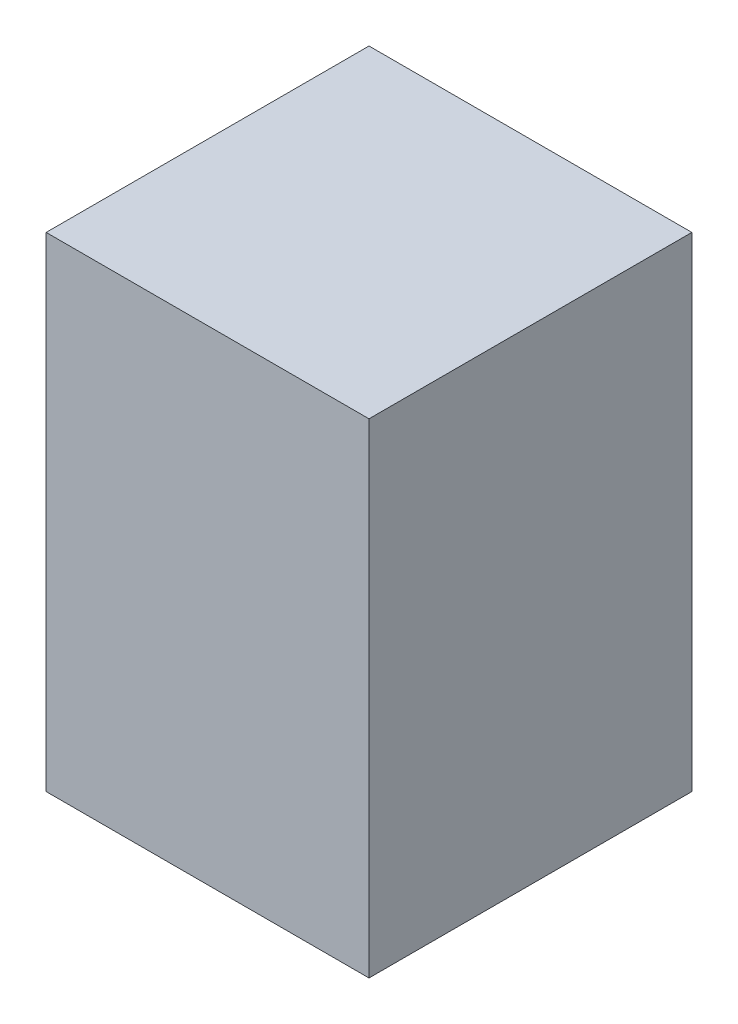
ISO-10303-21;
HEADER;
FILE_DESCRIPTION(('STEP AP214'),'2;1');
FILE_NAME('part.step','',(''),(''),'','','');
FILE_SCHEMA(('AUTOMOTIVE_DESIGN { 1 0 10303 214 1 1 1 1 }'));
ENDSEC;
DATA;
#1=APPLICATION_CONTEXT('core data for automotive mechanical design processes');
#2=APPLICATION_PROTOCOL_DEFINITION('international standard','automotive_design',2000,#1);
#3=PRODUCT_CONTEXT('',#1,'mechanical');
#4=PRODUCT('Part','Part','',(#3));
#5=PRODUCT_RELATED_PRODUCT_CATEGORY('part','',(#4));
#6=PRODUCT_DEFINITION_FORMATION('','',#4);
#7=PRODUCT_DEFINITION_CONTEXT('part definition',#1,'design');
#8=PRODUCT_DEFINITION('design','',#6,#7);
#9=PRODUCT_DEFINITION_SHAPE('','',#8);
#10=(LENGTH_UNIT() NAMED_UNIT(*) SI_UNIT(.MILLI.,.METRE.));
#11=(NAMED_UNIT(*) PLANE_ANGLE_UNIT() SI_UNIT($,.RADIAN.));
#12=(NAMED_UNIT(*) SI_UNIT($,.STERADIAN.) SOLID_ANGLE_UNIT());
#13=UNCERTAINTY_MEASURE_WITH_UNIT(LENGTH_MEASURE(1.E-05),#10,'distance_accuracy_value','');
#14=(GEOMETRIC_REPRESENTATION_CONTEXT(3) GLOBAL_UNCERTAINTY_ASSIGNED_CONTEXT((#13)) GLOBAL_UNIT_ASSIGNED_CONTEXT((#10,
#11,#12)) REPRESENTATION_CONTEXT('',''));
#15=CARTESIAN_POINT('',(0.,0.,0.));
#16=DIRECTION('',(0.,0.,1.));
#17=DIRECTION('',(1.,0.,0.));
#18=AXIS2_PLACEMENT_3D('',#15,#16,#17);
#19=CARTESIAN_POINT('',(5.,0.,5.));
#20=DIRECTION('',(0.,0.384615384615385,-0.923076923076923));
#21=DIRECTION('',(0.,0.923076923076923,0.384615384615385));
#22=AXIS2_PLACEMENT_3D('',#19,#20,#21);
#23=PLANE('',#22);
#24=DIRECTION('',(0.,0.923076923076923,0.384615384615385));
#25=VECTOR('',#24,1.);
#26=CARTESIAN_POINT('',(3.75,0.,5.));
#27=LINE('',#26,#25);
#28=CARTESIAN_POINT('',(3.75,-6.,2.5));
#29=VERTEX_POINT('',#28);
#30=CARTESIAN_POINT('',(3.75,0.,5.));
#31=VERTEX_POINT('',#30);
#32=EDGE_CURVE('E130',#29,#31,#27,.T.);
#33=ORIENTED_EDGE('',*,*,#32,.F.);
#34=DIRECTION('',(-1.,0.,0.));
#35=VECTOR('',#34,1.);
#36=CARTESIAN_POINT('',(5.,-6.,2.5));
#37=LINE('',#36,#35);
#38=CARTESIAN_POINT('',(5.,-6.,2.5));
#39=VERTEX_POINT('',#38);
#40=EDGE_CURVE('E158',#39,#29,#37,.T.);
#41=ORIENTED_EDGE('',*,*,#40,.F.);
#42=DIRECTION('',(0.,-0.923076923076923,-0.384615384615385));
#43=VECTOR('',#42,1.);
#44=CARTESIAN_POINT('',(5.,0.,5.));
#45=LINE('',#44,#43);
#46=CARTESIAN_POINT('',(5.,0.,5.));
#47=VERTEX_POINT('',#46);
#48=EDGE_CURVE('E150',#47,#39,#45,.T.);
#49=ORIENTED_EDGE('',*,*,#48,.F.);
#50=DIRECTION('',(-1.,0.,0.));
#51=VECTOR('',#50,1.);
#52=CARTESIAN_POINT('',(5.,0.,5.));
#53=LINE('',#52,#51);
#54=EDGE_CURVE('E145',#47,#31,#53,.T.);
#55=ORIENTED_EDGE('',*,*,#54,.T.);
#56=EDGE_LOOP('',(#33,#41,#49,#55));
#57=FACE_BOUND('',#56,.T.);
#58=ADVANCED_FACE('F39',(#57),#23,.F.);
#59=CARTESIAN_POINT('',(5.,-6.,2.5));
#60=DIRECTION('',(0.,1.,0.));
#61=DIRECTION('',(0.,0.,1.));
#62=AXIS2_PLACEMENT_3D('',#59,#60,#61);
#63=PLANE('',#62);
#64=DIRECTION('',(0.,0.,1.));
#65=VECTOR('',#64,1.);
#66=CARTESIAN_POINT('',(3.75,-6.,2.5));
#67=LINE('',#66,#65);
#68=CARTESIAN_POINT('',(3.75,-6.,-2.5));
#69=VERTEX_POINT('',#68);
#70=EDGE_CURVE('E133',#69,#29,#67,.T.);
#71=ORIENTED_EDGE('',*,*,#70,.F.);
#72=DIRECTION('',(-1.,0.,0.));
#73=VECTOR('',#72,1.);
#74=CARTESIAN_POINT('',(5.,-6.,-2.5));
#75=LINE('',#74,#73);
#76=CARTESIAN_POINT('',(5.,-6.,-2.5));
#77=VERTEX_POINT('',#76);
#78=EDGE_CURVE('E227',#77,#69,#75,.T.);
#79=ORIENTED_EDGE('',*,*,#78,.F.);
#80=DIRECTION('',(0.,0.,-1.));
#81=VECTOR('',#80,1.);
#82=CARTESIAN_POINT('',(5.,-6.,2.5));
#83=LINE('',#82,#81);
#84=EDGE_CURVE('E213',#39,#77,#83,.T.);
#85=ORIENTED_EDGE('',*,*,#84,.F.);
#86=ORIENTED_EDGE('',*,*,#40,.T.);
#87=EDGE_LOOP('',(#71,#79,#85,#86));
#88=FACE_BOUND('',#87,.T.);
#89=ADVANCED_FACE('F265',(#88),#63,.F.);
#90=CARTESIAN_POINT('',(5.,-6.,-2.5));
#91=DIRECTION('',(0.,0.384615384615384,0.923076923076923));
#92=DIRECTION('',(0.,-0.923076923076923,0.384615384615384));
#93=AXIS2_PLACEMENT_3D('',#90,#91,#92);
#94=PLANE('',#93);
#95=DIRECTION('',(0.,-0.923076923076923,0.384615384615384));
#96=VECTOR('',#95,1.);
#97=CARTESIAN_POINT('',(3.75,-6.,-2.5));
#98=LINE('',#97,#96);
#99=CARTESIAN_POINT('',(3.75,0.,-5.));
#100=VERTEX_POINT('',#99);
#101=EDGE_CURVE('E185',#100,#69,#98,.T.);
#102=ORIENTED_EDGE('',*,*,#101,.F.);
#103=DIRECTION('',(-1.,0.,0.));
#104=VECTOR('',#103,1.);
#105=CARTESIAN_POINT('',(5.,0.,-5.));
#106=LINE('',#105,#104);
#107=CARTESIAN_POINT('',(5.,0.,-5.));
#108=VERTEX_POINT('',#107);
#109=EDGE_CURVE('E147',#108,#100,#106,.T.);
#110=ORIENTED_EDGE('',*,*,#109,.F.);
#111=DIRECTION('',(0.,0.923076923076923,-0.384615384615384));
#112=VECTOR('',#111,1.);
#113=CARTESIAN_POINT('',(5.,-6.,-2.5));
#114=LINE('',#113,#112);
#115=EDGE_CURVE('E215',#77,#108,#114,.T.);
#116=ORIENTED_EDGE('',*,*,#115,.F.);
#117=ORIENTED_EDGE('',*,*,#78,.T.);
#118=EDGE_LOOP('',(#102,#110,#116,#117));
#119=FACE_BOUND('',#118,.T.);
#120=ADVANCED_FACE('F271',(#119),#94,.F.);
#121=CARTESIAN_POINT('',(5.,-3.,0.));
#122=DIRECTION('',(-1.,0.,0.));
#123=DIRECTION('',(0.,0.,1.));
#124=AXIS2_PLACEMENT_3D('',#121,#122,#123);
#125=CYLINDRICAL_SURFACE('',#124,1.);
#126=CARTESIAN_POINT('',(5.,-3.,0.));
#127=DIRECTION('',(1.,0.,0.));
#128=DIRECTION('',(0.,0.,-1.));
#129=AXIS2_PLACEMENT_3D('',#126,#127,#128);
#130=CIRCLE('',#129,1.);
#131=CARTESIAN_POINT('',(5.,-3.,-1.));
#132=VERTEX_POINT('',#131);
#133=EDGE_CURVE('E203',#132,#132,#130,.T.);
#134=ORIENTED_EDGE('',*,*,#133,.T.);
#135=EDGE_LOOP('',(#134));
#136=FACE_BOUND('',#135,.T.);
#137=CARTESIAN_POINT('',(3.75,-3.,0.));
#138=DIRECTION('',(-1.,0.,0.));
#139=DIRECTION('',(0.,0.,1.));
#140=AXIS2_PLACEMENT_3D('',#137,#138,#139);
#141=CIRCLE('',#140,1.);
#142=CARTESIAN_POINT('',(3.75,-3.,1.));
#143=VERTEX_POINT('',#142);
#144=EDGE_CURVE('E183',#143,#143,#141,.T.);
#145=ORIENTED_EDGE('',*,*,#144,.T.);
#146=EDGE_LOOP('',(#145));
#147=FACE_BOUND('',#146,.T.);
#148=ADVANCED_FACE('F262',(#136,#147),#125,.F.);
#149=CARTESIAN_POINT('',(0.,0.,0.));
#150=DIRECTION('',(0.,-1.,0.));
#151=DIRECTION('',(0.,0.,-1.));
#152=AXIS2_PLACEMENT_3D('',#149,#150,#151);
#153=PLANE('',#152);
#154=CARTESIAN_POINT('',(-3.75,0.,5.));
#155=VERTEX_POINT('',#154);
#156=CARTESIAN_POINT('',(-5.,0.,5.));
#157=VERTEX_POINT('',#156);
#158=EDGE_CURVE('E153',#155,#157,#53,.T.);
#159=ORIENTED_EDGE('',*,*,#158,.F.);
#160=DIRECTION('',(0.,0.,1.));
#161=VECTOR('',#160,1.);
#162=CARTESIAN_POINT('',(-3.75,0.,9.09176293791679));
#163=LINE('',#162,#161);
#164=CARTESIAN_POINT('',(-3.75,0.,-5.));
#165=VERTEX_POINT('',#164);
#166=EDGE_CURVE('E148',#165,#155,#163,.T.);
#167=ORIENTED_EDGE('',*,*,#166,.F.);
#168=CARTESIAN_POINT('',(-5.,0.,-5.));
#169=VERTEX_POINT('',#168);
#170=EDGE_CURVE('E64',#165,#169,#106,.T.);
#171=ORIENTED_EDGE('',*,*,#170,.T.);
#172=DIRECTION('',(0.,0.,1.));
#173=VECTOR('',#172,1.);
#174=CARTESIAN_POINT('',(-5.,0.,-5.));
#175=LINE('',#174,#173);
#176=EDGE_CURVE('E206',#169,#157,#175,.T.);
#177=ORIENTED_EDGE('',*,*,#176,.T.);
#178=EDGE_LOOP('',(#159,#167,#171,#177));
#179=FACE_BOUND('',#178,.T.);
#180=DIRECTION('',(0.,0.,1.));
#181=VECTOR('',#180,1.);
#182=CARTESIAN_POINT('',(3.75,0.,9.09176293791679));
#183=LINE('',#182,#181);
#184=EDGE_CURVE('E56',#100,#31,#183,.T.);
#185=ORIENTED_EDGE('',*,*,#184,.T.);
#186=ORIENTED_EDGE('',*,*,#54,.F.);
#187=DIRECTION('',(0.,0.,1.));
#188=VECTOR('',#187,1.);
#189=CARTESIAN_POINT('',(5.,0.,-5.));
#190=LINE('',#189,#188);
#191=EDGE_CURVE('E209',#108,#47,#190,.T.);
#192=ORIENTED_EDGE('',*,*,#191,.F.);
#193=ORIENTED_EDGE('',*,*,#109,.T.);
#194=EDGE_LOOP('',(#185,#186,#192,#193));
#195=FACE_BOUND('',#194,.T.);
#196=DIRECTION('',(0.,0.,-1.));
#197=VECTOR('',#196,1.);
#198=CARTESIAN_POINT('',(20.,0.,20.));
#199=LINE('',#198,#197);
#200=CARTESIAN_POINT('',(20.,0.,20.));
#201=VERTEX_POINT('',#200);
#202=CARTESIAN_POINT('',(20.,0.,-20.));
#203=VERTEX_POINT('',#202);
#204=EDGE_CURVE('E152',#201,#203,#199,.T.);
#205=ORIENTED_EDGE('',*,*,#204,.F.);
#206=DIRECTION('',(1.,0.,0.));
#207=VECTOR('',#206,1.);
#208=CARTESIAN_POINT('',(-20.,0.,20.));
#209=LINE('',#208,#207);
#210=CARTESIAN_POINT('',(-20.,0.,20.));
#211=VERTEX_POINT('',#210);
#212=EDGE_CURVE('E166',#211,#201,#209,.T.);
#213=ORIENTED_EDGE('',*,*,#212,.F.);
#214=DIRECTION('',(0.,0.,1.));
#215=VECTOR('',#214,1.);
#216=CARTESIAN_POINT('',(-20.,0.,20.));
#217=LINE('',#216,#215);
#218=CARTESIAN_POINT('',(-20.,0.,-20.));
#219=VERTEX_POINT('',#218);
#220=EDGE_CURVE('E174',#219,#211,#217,.T.);
#221=ORIENTED_EDGE('',*,*,#220,.F.);
#222=DIRECTION('',(-1.,0.,0.));
#223=VECTOR('',#222,1.);
#224=CARTESIAN_POINT('',(-20.,0.,-20.));
#225=LINE('',#224,#223);
#226=EDGE_CURVE('E156',#203,#219,#225,.T.);
#227=ORIENTED_EDGE('',*,*,#226,.F.);
#228=EDGE_LOOP('',(#205,#213,#221,#227));
#229=FACE_BOUND('',#228,.T.);
#230=ADVANCED_FACE('F142',(#179,#195,#229),#153,.T.);
#231=CARTESIAN_POINT('',(20.,60.,20.));
#232=DIRECTION('',(-1.,0.,0.));
#233=DIRECTION('',(0.,0.,1.));
#234=AXIS2_PLACEMENT_3D('',#231,#232,#233);
#235=PLANE('',#234);
#236=ORIENTED_EDGE('',*,*,#204,.T.);
#237=DIRECTION('',(0.,-1.,0.));
#238=VECTOR('',#237,1.);
#239=CARTESIAN_POINT('',(20.,60.,-20.));
#240=LINE('',#239,#238);
#241=CARTESIAN_POINT('',(20.,60.,-20.));
#242=VERTEX_POINT('',#241);
#243=EDGE_CURVE('E11',#242,#203,#240,.T.);
#244=ORIENTED_EDGE('',*,*,#243,.F.);
#245=DIRECTION('',(0.,0.,-1.));
#246=VECTOR('',#245,1.);
#247=CARTESIAN_POINT('',(20.,60.,20.));
#248=LINE('',#247,#246);
#249=CARTESIAN_POINT('',(20.,60.,20.));
#250=VERTEX_POINT('',#249);
#251=EDGE_CURVE('E162',#250,#242,#248,.T.);
#252=ORIENTED_EDGE('',*,*,#251,.F.);
#253=DIRECTION('',(0.,-1.,0.));
#254=VECTOR('',#253,1.);
#255=CARTESIAN_POINT('',(20.,60.,20.));
#256=LINE('',#255,#254);
#257=EDGE_CURVE('E171',#250,#201,#256,.T.);
#258=ORIENTED_EDGE('',*,*,#257,.T.);
#259=EDGE_LOOP('',(#236,#244,#252,#258));
#260=FACE_BOUND('',#259,.T.);
#261=ADVANCED_FACE('F41',(#260),#235,.F.);
#262=CARTESIAN_POINT('',(-20.,60.,-20.));
#263=DIRECTION('',(0.,0.,1.));
#264=DIRECTION('',(1.,0.,0.));
#265=AXIS2_PLACEMENT_3D('',#262,#263,#264);
#266=PLANE('',#265);
#267=ORIENTED_EDGE('',*,*,#226,.T.);
#268=DIRECTION('',(0.,-1.,0.));
#269=VECTOR('',#268,1.);
#270=CARTESIAN_POINT('',(-20.,60.,-20.));
#271=LINE('',#270,#269);
#272=CARTESIAN_POINT('',(-20.,60.,-20.));
#273=VERTEX_POINT('',#272);
#274=EDGE_CURVE('E48',#273,#219,#271,.T.);
#275=ORIENTED_EDGE('',*,*,#274,.F.);
#276=DIRECTION('',(-1.,0.,0.));
#277=VECTOR('',#276,1.);
#278=CARTESIAN_POINT('',(-20.,60.,-20.));
#279=LINE('',#278,#277);
#280=EDGE_CURVE('E165',#242,#273,#279,.T.);
#281=ORIENTED_EDGE('',*,*,#280,.F.);
#282=ORIENTED_EDGE('',*,*,#243,.T.);
#283=EDGE_LOOP('',(#267,#275,#281,#282));
#284=FACE_BOUND('',#283,.T.);
#285=ADVANCED_FACE('F306',(#284),#266,.F.);
#286=CARTESIAN_POINT('',(-20.,60.,20.));
#287=DIRECTION('',(1.,0.,0.));
#288=DIRECTION('',(0.,0.,-1.));
#289=AXIS2_PLACEMENT_3D('',#286,#287,#288);
#290=PLANE('',#289);
#291=ORIENTED_EDGE('',*,*,#220,.T.);
#292=DIRECTION('',(0.,-1.,0.));
#293=VECTOR('',#292,1.);
#294=CARTESIAN_POINT('',(-20.,60.,20.));
#295=LINE('',#294,#293);
#296=CARTESIAN_POINT('',(-20.,60.,20.));
#297=VERTEX_POINT('',#296);
#298=EDGE_CURVE('E179',#297,#211,#295,.T.);
#299=ORIENTED_EDGE('',*,*,#298,.F.);
#300=DIRECTION('',(0.,0.,1.));
#301=VECTOR('',#300,1.);
#302=CARTESIAN_POINT('',(-20.,60.,20.));
#303=LINE('',#302,#301);
#304=EDGE_CURVE('E168',#273,#297,#303,.T.);
#305=ORIENTED_EDGE('',*,*,#304,.F.);
#306=ORIENTED_EDGE('',*,*,#274,.T.);
#307=EDGE_LOOP('',(#291,#299,#305,#306));
#308=FACE_BOUND('',#307,.T.);
#309=ADVANCED_FACE('F312',(#308),#290,.F.);
#310=CARTESIAN_POINT('',(-20.,60.,20.));
#311=DIRECTION('',(0.,0.,-1.));
#312=DIRECTION('',(-1.,0.,0.));
#313=AXIS2_PLACEMENT_3D('',#310,#311,#312);
#314=PLANE('',#313);
#315=ORIENTED_EDGE('',*,*,#212,.T.);
#316=ORIENTED_EDGE('',*,*,#257,.F.);
#317=DIRECTION('',(1.,0.,0.));
#318=VECTOR('',#317,1.);
#319=CARTESIAN_POINT('',(-20.,60.,20.));
#320=LINE('',#319,#318);
#321=EDGE_CURVE('E170',#297,#250,#320,.T.);
#322=ORIENTED_EDGE('',*,*,#321,.F.);
#323=ORIENTED_EDGE('',*,*,#298,.T.);
#324=EDGE_LOOP('',(#315,#316,#322,#323));
#325=FACE_BOUND('',#324,.T.);
#326=ADVANCED_FACE('F309',(#325),#314,.F.);
#327=CARTESIAN_POINT('',(0.,60.,0.));
#328=DIRECTION('',(0.,-1.,0.));
#329=DIRECTION('',(0.,0.,-1.));
#330=AXIS2_PLACEMENT_3D('',#327,#328,#329);
#331=PLANE('',#330);
#332=ORIENTED_EDGE('',*,*,#251,.T.);
#333=ORIENTED_EDGE('',*,*,#280,.T.);
#334=ORIENTED_EDGE('',*,*,#304,.T.);
#335=ORIENTED_EDGE('',*,*,#321,.T.);
#336=EDGE_LOOP('',(#332,#333,#334,#335));
#337=FACE_BOUND('',#336,.T.);
#338=ADVANCED_FACE('F285',(#337),#331,.F.);
#339=CARTESIAN_POINT('',(5.,0.,0.));
#340=DIRECTION('',(1.,0.,0.));
#341=DIRECTION('',(0.,0.,-1.));
#342=AXIS2_PLACEMENT_3D('',#339,#340,#341);
#343=PLANE('',#342);
#344=ORIENTED_EDGE('',*,*,#191,.T.);
#345=ORIENTED_EDGE('',*,*,#48,.T.);
#346=ORIENTED_EDGE('',*,*,#84,.T.);
#347=ORIENTED_EDGE('',*,*,#115,.T.);
#348=EDGE_LOOP('',(#344,#345,#346,#347));
#349=FACE_BOUND('',#348,.T.);
#350=ORIENTED_EDGE('',*,*,#133,.F.);
#351=EDGE_LOOP('',(#350));
#352=FACE_BOUND('',#351,.T.);
#353=ADVANCED_FACE('F281',(#349,#352),#343,.T.);
#354=CARTESIAN_POINT('',(-5.,0.,0.));
#355=DIRECTION('',(1.,0.,0.));
#356=DIRECTION('',(0.,0.,-1.));
#357=AXIS2_PLACEMENT_3D('',#354,#355,#356);
#358=PLANE('',#357);
#359=ORIENTED_EDGE('',*,*,#176,.F.);
#360=DIRECTION('',(0.,0.923076923076923,-0.384615384615384));
#361=VECTOR('',#360,1.);
#362=CARTESIAN_POINT('',(-5.,-6.,-2.5));
#363=LINE('',#362,#361);
#364=CARTESIAN_POINT('',(-5.,-6.,-2.5));
#365=VERTEX_POINT('',#364);
#366=EDGE_CURVE('E211',#365,#169,#363,.T.);
#367=ORIENTED_EDGE('',*,*,#366,.F.);
#368=DIRECTION('',(0.,0.,-1.));
#369=VECTOR('',#368,1.);
#370=CARTESIAN_POINT('',(-5.,-6.,2.5));
#371=LINE('',#370,#369);
#372=CARTESIAN_POINT('',(-5.,-6.,2.5));
#373=VERTEX_POINT('',#372);
#374=EDGE_CURVE('E221',#373,#365,#371,.T.);
#375=ORIENTED_EDGE('',*,*,#374,.F.);
#376=DIRECTION('',(0.,-0.923076923076923,-0.384615384615385));
#377=VECTOR('',#376,1.);
#378=CARTESIAN_POINT('',(-5.,0.,5.));
#379=LINE('',#378,#377);
#380=EDGE_CURVE('E218',#157,#373,#379,.T.);
#381=ORIENTED_EDGE('',*,*,#380,.F.);
#382=EDGE_LOOP('',(#359,#367,#375,#381));
#383=FACE_BOUND('',#382,.T.);
#384=CARTESIAN_POINT('',(-5.,-3.,0.));
#385=DIRECTION('',(1.,0.,0.));
#386=DIRECTION('',(0.,0.,-1.));
#387=AXIS2_PLACEMENT_3D('',#384,#385,#386);
#388=CIRCLE('',#387,1.);
#389=CARTESIAN_POINT('',(-5.,-3.,-1.));
#390=VERTEX_POINT('',#389);
#391=EDGE_CURVE('E202',#390,#390,#388,.T.);
#392=ORIENTED_EDGE('',*,*,#391,.T.);
#393=EDGE_LOOP('',(#392));
#394=FACE_BOUND('',#393,.T.);
#395=ADVANCED_FACE('F243',(#383,#394),#358,.F.);
#396=CARTESIAN_POINT('',(-3.75,-6.,2.5));
#397=VERTEX_POINT('',#396);
#398=EDGE_CURVE('E229',#397,#373,#37,.T.);
#399=ORIENTED_EDGE('',*,*,#398,.F.);
#400=DIRECTION('',(0.,0.923076923076923,0.384615384615385));
#401=VECTOR('',#400,1.);
#402=CARTESIAN_POINT('',(-3.75,0.,5.));
#403=LINE('',#402,#401);
#404=EDGE_CURVE('E200',#397,#155,#403,.T.);
#405=ORIENTED_EDGE('',*,*,#404,.T.);
#406=ORIENTED_EDGE('',*,*,#158,.T.);
#407=ORIENTED_EDGE('',*,*,#380,.T.);
#408=EDGE_LOOP('',(#399,#405,#406,#407));
#409=FACE_BOUND('',#408,.T.);
#410=ADVANCED_FACE('F247',(#409),#23,.F.);
#411=CARTESIAN_POINT('',(-3.75,-6.,-2.5));
#412=VERTEX_POINT('',#411);
#413=EDGE_CURVE('E226',#412,#365,#75,.T.);
#414=ORIENTED_EDGE('',*,*,#413,.F.);
#415=DIRECTION('',(0.,0.,1.));
#416=VECTOR('',#415,1.);
#417=CARTESIAN_POINT('',(-3.75,-6.,2.5));
#418=LINE('',#417,#416);
#419=EDGE_CURVE('E197',#412,#397,#418,.T.);
#420=ORIENTED_EDGE('',*,*,#419,.T.);
#421=ORIENTED_EDGE('',*,*,#398,.T.);
#422=ORIENTED_EDGE('',*,*,#374,.T.);
#423=EDGE_LOOP('',(#414,#420,#421,#422));
#424=FACE_BOUND('',#423,.T.);
#425=ADVANCED_FACE('F239',(#424),#63,.F.);
#426=ORIENTED_EDGE('',*,*,#170,.F.);
#427=DIRECTION('',(0.,-0.923076923076923,0.384615384615384));
#428=VECTOR('',#427,1.);
#429=CARTESIAN_POINT('',(-3.75,-6.,-2.5));
#430=LINE('',#429,#428);
#431=EDGE_CURVE('E194',#165,#412,#430,.T.);
#432=ORIENTED_EDGE('',*,*,#431,.T.);
#433=ORIENTED_EDGE('',*,*,#413,.T.);
#434=ORIENTED_EDGE('',*,*,#366,.T.);
#435=EDGE_LOOP('',(#426,#432,#433,#434));
#436=FACE_BOUND('',#435,.T.);
#437=ADVANCED_FACE('F235',(#436),#94,.F.);
#438=CARTESIAN_POINT('',(-3.75,-3.,0.));
#439=DIRECTION('',(-1.,0.,0.));
#440=DIRECTION('',(0.,0.,1.));
#441=AXIS2_PLACEMENT_3D('',#438,#439,#440);
#442=CIRCLE('',#441,1.);
#443=CARTESIAN_POINT('',(-3.75,-3.,1.));
#444=VERTEX_POINT('',#443);
#445=EDGE_CURVE('E43',#444,#444,#442,.T.);
#446=ORIENTED_EDGE('',*,*,#445,.F.);
#447=EDGE_LOOP('',(#446));
#448=FACE_BOUND('',#447,.T.);
#449=ORIENTED_EDGE('',*,*,#391,.F.);
#450=EDGE_LOOP('',(#449));
#451=FACE_BOUND('',#450,.T.);
#452=ADVANCED_FACE('F250',(#448,#451),#125,.F.);
#453=CARTESIAN_POINT('',(-3.75,0.,0.));
#454=DIRECTION('',(-1.,0.,0.));
#455=DIRECTION('',(0.,0.,1.));
#456=AXIS2_PLACEMENT_3D('',#453,#454,#455);
#457=PLANE('',#456);
#458=ORIENTED_EDGE('',*,*,#445,.T.);
#459=EDGE_LOOP('',(#458));
#460=FACE_BOUND('',#459,.T.);
#461=ORIENTED_EDGE('',*,*,#419,.F.);
#462=ORIENTED_EDGE('',*,*,#431,.F.);
#463=ORIENTED_EDGE('',*,*,#166,.T.);
#464=ORIENTED_EDGE('',*,*,#404,.F.);
#465=EDGE_LOOP('',(#461,#462,#463,#464));
#466=FACE_BOUND('',#465,.T.);
#467=ADVANCED_FACE('F248',(#460,#466),#457,.F.);
#468=CARTESIAN_POINT('',(3.75,0.,0.));
#469=DIRECTION('',(-1.,0.,0.));
#470=DIRECTION('',(0.,0.,1.));
#471=AXIS2_PLACEMENT_3D('',#468,#469,#470);
#472=PLANE('',#471);
#473=ORIENTED_EDGE('',*,*,#144,.F.);
#474=EDGE_LOOP('',(#473));
#475=FACE_BOUND('',#474,.T.);
#476=ORIENTED_EDGE('',*,*,#32,.T.);
#477=ORIENTED_EDGE('',*,*,#184,.F.);
#478=ORIENTED_EDGE('',*,*,#101,.T.);
#479=ORIENTED_EDGE('',*,*,#70,.T.);
#480=EDGE_LOOP('',(#476,#477,#478,#479));
#481=FACE_BOUND('',#480,.T.);
#482=ADVANCED_FACE('F131',(#475,#481),#472,.T.);
#483=CLOSED_SHELL('',(#58,#89,#120,#148,#230,#261,#285,#309,#326,#338,#353,#395,#410,#425,#437,
#452,#467,#482));
#484=MANIFOLD_SOLID_BREP('B2',#483);
#485=ADVANCED_BREP_SHAPE_REPRESENTATION('',(#18,#484),#14);
#486=SHAPE_DEFINITION_REPRESENTATION(#9,#485);
ENDSEC;
END-ISO-10303-21;
